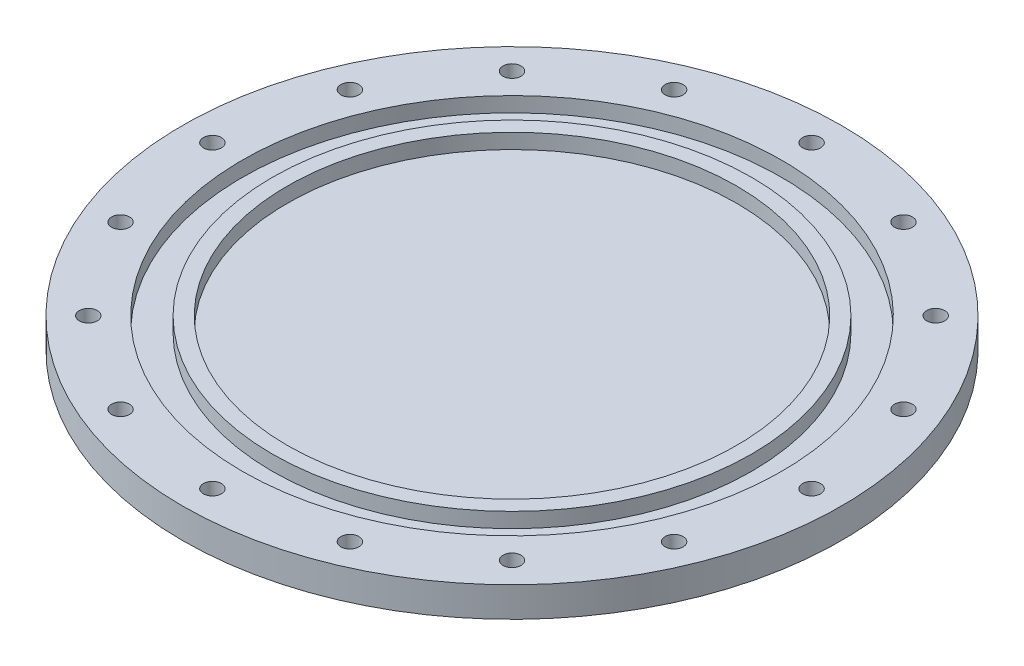
ISO-10303-21;
HEADER;
FILE_DESCRIPTION(('STEP AP214'),'2;1');
FILE_NAME('part.step','',(''),(''),'','','');
FILE_SCHEMA(('AUTOMOTIVE_DESIGN { 1 0 10303 214 1 1 1 1 }'));
ENDSEC;
DATA;
#1=APPLICATION_CONTEXT('core data for automotive mechanical design processes');
#2=APPLICATION_PROTOCOL_DEFINITION('international standard','automotive_design',2000,#1);
#3=PRODUCT_CONTEXT('',#1,'mechanical');
#4=PRODUCT('Part','Part','',(#3));
#5=PRODUCT_RELATED_PRODUCT_CATEGORY('part','',(#4));
#6=PRODUCT_DEFINITION_FORMATION('','',#4);
#7=PRODUCT_DEFINITION_CONTEXT('part definition',#1,'design');
#8=PRODUCT_DEFINITION('design','',#6,#7);
#9=PRODUCT_DEFINITION_SHAPE('','',#8);
#10=(LENGTH_UNIT() NAMED_UNIT(*) SI_UNIT(.MILLI.,.METRE.));
#11=(NAMED_UNIT(*) PLANE_ANGLE_UNIT() SI_UNIT($,.RADIAN.));
#12=(NAMED_UNIT(*) SI_UNIT($,.STERADIAN.) SOLID_ANGLE_UNIT());
#13=UNCERTAINTY_MEASURE_WITH_UNIT(LENGTH_MEASURE(1.E-05),#10,'distance_accuracy_value','');
#14=(GEOMETRIC_REPRESENTATION_CONTEXT(3) GLOBAL_UNCERTAINTY_ASSIGNED_CONTEXT((#13)) GLOBAL_UNIT_ASSIGNED_CONTEXT((#10,
#11,#12)) REPRESENTATION_CONTEXT('',''));
#15=CARTESIAN_POINT('',(0.,0.,0.));
#16=DIRECTION('',(0.,0.,1.));
#17=DIRECTION('',(1.,0.,0.));
#18=AXIS2_PLACEMENT_3D('',#15,#16,#17);
#19=CARTESIAN_POINT('',(0.,10.,0.));
#20=DIRECTION('',(0.,-1.,0.));
#21=DIRECTION('',(0.,0.,-1.));
#22=AXIS2_PLACEMENT_3D('',#19,#20,#21);
#23=CYLINDRICAL_SURFACE('',#22,90.);
#24=CARTESIAN_POINT('',(0.,5.,0.));
#25=DIRECTION('',(0.,1.,0.));
#26=DIRECTION('',(0.,0.,1.));
#27=AXIS2_PLACEMENT_3D('',#24,#25,#26);
#28=CIRCLE('',#27,90.);
#29=CARTESIAN_POINT('',(0.,5.,90.));
#30=VERTEX_POINT('',#29);
#31=EDGE_CURVE('E57',#30,#30,#28,.T.);
#32=ORIENTED_EDGE('',*,*,#31,.F.);
#33=EDGE_LOOP('',(#32));
#34=FACE_BOUND('',#33,.T.);
#35=CARTESIAN_POINT('',(0.,10.,0.));
#36=DIRECTION('',(0.,1.,0.));
#37=DIRECTION('',(0.,0.,1.));
#38=AXIS2_PLACEMENT_3D('',#35,#36,#37);
#39=CIRCLE('',#38,90.);
#40=CARTESIAN_POINT('',(0.,10.,90.));
#41=VERTEX_POINT('',#40);
#42=EDGE_CURVE('E65',#41,#41,#39,.T.);
#43=ORIENTED_EDGE('',*,*,#42,.T.);
#44=EDGE_LOOP('',(#43));
#45=FACE_BOUND('',#44,.T.);
#46=ADVANCED_FACE('F50',(#34,#45),#23,.F.);
#47=CARTESIAN_POINT('',(0.,10.,-100.));
#48=DIRECTION('',(0.,-1.,0.));
#49=DIRECTION('',(0.,0.,-1.));
#50=AXIS2_PLACEMENT_3D('',#47,#48,#49);
#51=CYLINDRICAL_SURFACE('',#50,3.);
#52=CARTESIAN_POINT('',(0.,10.,-100.));
#53=DIRECTION('',(0.,1.,0.));
#54=DIRECTION('',(0.,0.,1.));
#55=AXIS2_PLACEMENT_3D('',#52,#53,#54);
#56=CIRCLE('',#55,3.);
#57=CARTESIAN_POINT('',(0.,10.,-97.));
#58=VERTEX_POINT('',#57);
#59=EDGE_CURVE('E123',#58,#58,#56,.T.);
#60=ORIENTED_EDGE('',*,*,#59,.T.);
#61=EDGE_LOOP('',(#60));
#62=FACE_BOUND('',#61,.T.);
#63=CARTESIAN_POINT('',(0.,0.,-100.));
#64=DIRECTION('',(0.,1.,0.));
#65=DIRECTION('',(0.,0.,1.));
#66=AXIS2_PLACEMENT_3D('',#63,#64,#65);
#67=CIRCLE('',#66,3.);
#68=CARTESIAN_POINT('',(0.,0.,-97.));
#69=VERTEX_POINT('',#68);
#70=EDGE_CURVE('E72',#69,#69,#67,.T.);
#71=ORIENTED_EDGE('',*,*,#70,.F.);
#72=EDGE_LOOP('',(#71));
#73=FACE_BOUND('',#72,.T.);
#74=ADVANCED_FACE('F199',(#62,#73),#51,.F.);
#75=CARTESIAN_POINT('',(38.2683432365091,10.,-92.3879532511297));
#76=DIRECTION('',(0.,-1.,0.));
#77=DIRECTION('',(0.,0.,-1.));
#78=AXIS2_PLACEMENT_3D('',#75,#76,#77);
#79=CYLINDRICAL_SURFACE('',#78,3.);
#80=CARTESIAN_POINT('',(38.2683432365091,10.,-92.3879532511297));
#81=DIRECTION('',(0.,1.,0.));
#82=DIRECTION('',(0.,0.,1.));
#83=AXIS2_PLACEMENT_3D('',#80,#81,#82);
#84=CIRCLE('',#83,3.);
#85=CARTESIAN_POINT('',(38.2683432365091,10.,-89.3879532511297));
#86=VERTEX_POINT('',#85);
#87=EDGE_CURVE('E126',#86,#86,#84,.T.);
#88=ORIENTED_EDGE('',*,*,#87,.T.);
#89=EDGE_LOOP('',(#88));
#90=FACE_BOUND('',#89,.T.);
#91=CARTESIAN_POINT('',(38.2683432365091,0.,-92.3879532511297));
#92=DIRECTION('',(0.,1.,0.));
#93=DIRECTION('',(0.,0.,1.));
#94=AXIS2_PLACEMENT_3D('',#91,#92,#93);
#95=CIRCLE('',#94,3.);
#96=CARTESIAN_POINT('',(38.2683432365091,0.,-89.3879532511297));
#97=VERTEX_POINT('',#96);
#98=EDGE_CURVE('E75',#97,#97,#95,.T.);
#99=ORIENTED_EDGE('',*,*,#98,.F.);
#100=EDGE_LOOP('',(#99));
#101=FACE_BOUND('',#100,.T.);
#102=ADVANCED_FACE('F205',(#90,#101),#79,.F.);
#103=CARTESIAN_POINT('',(70.7106781186556,10.,-70.7106781186567));
#104=DIRECTION('',(0.,-1.,0.));
#105=DIRECTION('',(0.,0.,-1.));
#106=AXIS2_PLACEMENT_3D('',#103,#104,#105);
#107=CYLINDRICAL_SURFACE('',#106,3.00000000000001);
#108=CARTESIAN_POINT('',(70.7106781186556,10.,-70.7106781186567));
#109=DIRECTION('',(0.,1.,0.));
#110=DIRECTION('',(0.,0.,1.));
#111=AXIS2_PLACEMENT_3D('',#108,#109,#110);
#112=CIRCLE('',#111,3.00000000000001);
#113=CARTESIAN_POINT('',(70.7106781186556,10.,-67.7106781186567));
#114=VERTEX_POINT('',#113);
#115=EDGE_CURVE('E129',#114,#114,#112,.T.);
#116=ORIENTED_EDGE('',*,*,#115,.T.);
#117=EDGE_LOOP('',(#116));
#118=FACE_BOUND('',#117,.T.);
#119=CARTESIAN_POINT('',(70.7106781186556,0.,-70.7106781186567));
#120=DIRECTION('',(0.,1.,0.));
#121=DIRECTION('',(0.,0.,1.));
#122=AXIS2_PLACEMENT_3D('',#119,#120,#121);
#123=CIRCLE('',#122,3.00000000000001);
#124=CARTESIAN_POINT('',(70.7106781186556,0.,-67.7106781186567));
#125=VERTEX_POINT('',#124);
#126=EDGE_CURVE('E78',#125,#125,#123,.T.);
#127=ORIENTED_EDGE('',*,*,#126,.F.);
#128=EDGE_LOOP('',(#127));
#129=FACE_BOUND('',#128,.T.);
#130=ADVANCED_FACE('F215',(#118,#129),#107,.F.);
#131=CARTESIAN_POINT('',(92.3879532511304,10.,-38.2683432365115));
#132=DIRECTION('',(0.,-1.,0.));
#133=DIRECTION('',(0.,0.,-1.));
#134=AXIS2_PLACEMENT_3D('',#131,#132,#133);
#135=CYLINDRICAL_SURFACE('',#134,3.00000000000001);
#136=CARTESIAN_POINT('',(92.3879532511304,10.,-38.2683432365115));
#137=DIRECTION('',(0.,1.,0.));
#138=DIRECTION('',(0.,0.,1.));
#139=AXIS2_PLACEMENT_3D('',#136,#137,#138);
#140=CIRCLE('',#139,3.00000000000001);
#141=CARTESIAN_POINT('',(92.3879532511304,10.,-35.2683432365115));
#142=VERTEX_POINT('',#141);
#143=EDGE_CURVE('E132',#142,#142,#140,.T.);
#144=ORIENTED_EDGE('',*,*,#143,.T.);
#145=EDGE_LOOP('',(#144));
#146=FACE_BOUND('',#145,.T.);
#147=CARTESIAN_POINT('',(92.3879532511304,0.,-38.2683432365115));
#148=DIRECTION('',(0.,1.,0.));
#149=DIRECTION('',(0.,0.,1.));
#150=AXIS2_PLACEMENT_3D('',#147,#148,#149);
#151=CIRCLE('',#150,3.00000000000001);
#152=CARTESIAN_POINT('',(92.3879532511304,0.,-35.2683432365115));
#153=VERTEX_POINT('',#152);
#154=EDGE_CURVE('E81',#153,#153,#151,.T.);
#155=ORIENTED_EDGE('',*,*,#154,.F.);
#156=EDGE_LOOP('',(#155));
#157=FACE_BOUND('',#156,.T.);
#158=ADVANCED_FACE('F219',(#146,#157),#135,.F.);
#159=CARTESIAN_POINT('',(100.000000000003,10.,-2.76131949507121E-12));
#160=DIRECTION('',(0.,-1.,0.));
#161=DIRECTION('',(0.,0.,-1.));
#162=AXIS2_PLACEMENT_3D('',#159,#160,#161);
#163=CYLINDRICAL_SURFACE('',#162,3.00000000000001);
#164=CARTESIAN_POINT('',(100.000000000003,10.,-2.76131949507121E-12));
#165=DIRECTION('',(0.,1.,0.));
#166=DIRECTION('',(0.,0.,1.));
#167=AXIS2_PLACEMENT_3D('',#164,#165,#166);
#168=CIRCLE('',#167,3.00000000000001);
#169=CARTESIAN_POINT('',(100.000000000003,10.,2.99999999999725));
#170=VERTEX_POINT('',#169);
#171=EDGE_CURVE('E135',#170,#170,#168,.T.);
#172=ORIENTED_EDGE('',*,*,#171,.T.);
#173=EDGE_LOOP('',(#172));
#174=FACE_BOUND('',#173,.T.);
#175=CARTESIAN_POINT('',(100.000000000003,0.,-2.76131949507121E-12));
#176=DIRECTION('',(0.,1.,0.));
#177=DIRECTION('',(0.,0.,1.));
#178=AXIS2_PLACEMENT_3D('',#175,#176,#177);
#179=CIRCLE('',#178,3.00000000000001);
#180=CARTESIAN_POINT('',(100.000000000003,0.,2.99999999999725));
#181=VERTEX_POINT('',#180);
#182=EDGE_CURVE('E84',#181,#181,#179,.T.);
#183=ORIENTED_EDGE('',*,*,#182,.F.);
#184=EDGE_LOOP('',(#183));
#185=FACE_BOUND('',#184,.T.);
#186=ADVANCED_FACE('F223',(#174,#185),#163,.F.);
#187=CARTESIAN_POINT('',(92.3879532511325,10.,38.2683432365064));
#188=DIRECTION('',(0.,-1.,0.));
#189=DIRECTION('',(0.,0.,-1.));
#190=AXIS2_PLACEMENT_3D('',#187,#188,#189);
#191=CYLINDRICAL_SURFACE('',#190,3.00000000000001);
#192=CARTESIAN_POINT('',(92.3879532511325,10.,38.2683432365064));
#193=DIRECTION('',(0.,1.,0.));
#194=DIRECTION('',(0.,0.,1.));
#195=AXIS2_PLACEMENT_3D('',#192,#193,#194);
#196=CIRCLE('',#195,3.00000000000001);
#197=CARTESIAN_POINT('',(92.3879532511325,10.,41.2683432365064));
#198=VERTEX_POINT('',#197);
#199=EDGE_CURVE('E138',#198,#198,#196,.T.);
#200=ORIENTED_EDGE('',*,*,#199,.T.);
#201=EDGE_LOOP('',(#200));
#202=FACE_BOUND('',#201,.T.);
#203=CARTESIAN_POINT('',(92.3879532511325,0.,38.2683432365064));
#204=DIRECTION('',(0.,1.,0.));
#205=DIRECTION('',(0.,0.,1.));
#206=AXIS2_PLACEMENT_3D('',#203,#204,#205);
#207=CIRCLE('',#206,3.00000000000001);
#208=CARTESIAN_POINT('',(92.3879532511325,0.,41.2683432365064));
#209=VERTEX_POINT('',#208);
#210=EDGE_CURVE('E87',#209,#209,#207,.T.);
#211=ORIENTED_EDGE('',*,*,#210,.F.);
#212=EDGE_LOOP('',(#211));
#213=FACE_BOUND('',#212,.T.);
#214=ADVANCED_FACE('F227',(#202,#213),#191,.F.);
#215=CARTESIAN_POINT('',(70.7106781186595,10.,70.7106781186528));
#216=DIRECTION('',(0.,-1.,0.));
#217=DIRECTION('',(0.,0.,-1.));
#218=AXIS2_PLACEMENT_3D('',#215,#216,#217);
#219=CYLINDRICAL_SURFACE('',#218,3.00000000000001);
#220=CARTESIAN_POINT('',(70.7106781186595,10.,70.7106781186528));
#221=DIRECTION('',(0.,1.,0.));
#222=DIRECTION('',(0.,0.,1.));
#223=AXIS2_PLACEMENT_3D('',#220,#221,#222);
#224=CIRCLE('',#223,3.00000000000001);
#225=CARTESIAN_POINT('',(70.7106781186595,10.,73.7106781186528));
#226=VERTEX_POINT('',#225);
#227=EDGE_CURVE('E141',#226,#226,#224,.T.);
#228=ORIENTED_EDGE('',*,*,#227,.T.);
#229=EDGE_LOOP('',(#228));
#230=FACE_BOUND('',#229,.T.);
#231=CARTESIAN_POINT('',(70.7106781186595,0.,70.7106781186528));
#232=DIRECTION('',(0.,1.,0.));
#233=DIRECTION('',(0.,0.,1.));
#234=AXIS2_PLACEMENT_3D('',#231,#232,#233);
#235=CIRCLE('',#234,3.00000000000001);
#236=CARTESIAN_POINT('',(70.7106781186595,0.,73.7106781186528));
#237=VERTEX_POINT('',#236);
#238=EDGE_CURVE('E90',#237,#237,#235,.T.);
#239=ORIENTED_EDGE('',*,*,#238,.F.);
#240=EDGE_LOOP('',(#239));
#241=FACE_BOUND('',#240,.T.);
#242=ADVANCED_FACE('F231',(#230,#241),#219,.F.);
#243=CARTESIAN_POINT('',(38.2683432365143,10.,92.3879532511276));
#244=DIRECTION('',(0.,-1.,0.));
#245=DIRECTION('',(0.,0.,-1.));
#246=AXIS2_PLACEMENT_3D('',#243,#244,#245);
#247=CYLINDRICAL_SURFACE('',#246,3.);
#248=CARTESIAN_POINT('',(38.2683432365143,10.,92.3879532511276));
#249=DIRECTION('',(0.,1.,0.));
#250=DIRECTION('',(0.,0.,1.));
#251=AXIS2_PLACEMENT_3D('',#248,#249,#250);
#252=CIRCLE('',#251,3.);
#253=CARTESIAN_POINT('',(38.2683432365143,10.,95.3879532511276));
#254=VERTEX_POINT('',#253);
#255=EDGE_CURVE('E144',#254,#254,#252,.T.);
#256=ORIENTED_EDGE('',*,*,#255,.T.);
#257=EDGE_LOOP('',(#256));
#258=FACE_BOUND('',#257,.T.);
#259=CARTESIAN_POINT('',(38.2683432365143,0.,92.3879532511276));
#260=DIRECTION('',(0.,1.,0.));
#261=DIRECTION('',(0.,0.,1.));
#262=AXIS2_PLACEMENT_3D('',#259,#260,#261);
#263=CIRCLE('',#262,3.);
#264=CARTESIAN_POINT('',(38.2683432365143,0.,95.3879532511276));
#265=VERTEX_POINT('',#264);
#266=EDGE_CURVE('E93',#265,#265,#263,.T.);
#267=ORIENTED_EDGE('',*,*,#266,.F.);
#268=EDGE_LOOP('',(#267));
#269=FACE_BOUND('',#268,.T.);
#270=ADVANCED_FACE('F235',(#258,#269),#247,.F.);
#271=CARTESIAN_POINT('',(5.52263899014242E-12,10.,100.));
#272=DIRECTION('',(0.,-1.,0.));
#273=DIRECTION('',(0.,0.,-1.));
#274=AXIS2_PLACEMENT_3D('',#271,#272,#273);
#275=CYLINDRICAL_SURFACE('',#274,3.);
#276=CARTESIAN_POINT('',(5.52263899014242E-12,10.,100.));
#277=DIRECTION('',(0.,1.,0.));
#278=DIRECTION('',(0.,0.,1.));
#279=AXIS2_PLACEMENT_3D('',#276,#277,#278);
#280=CIRCLE('',#279,3.);
#281=CARTESIAN_POINT('',(5.52263899014242E-12,10.,103.));
#282=VERTEX_POINT('',#281);
#283=EDGE_CURVE('E147',#282,#282,#280,.T.);
#284=ORIENTED_EDGE('',*,*,#283,.T.);
#285=EDGE_LOOP('',(#284));
#286=FACE_BOUND('',#285,.T.);
#287=CARTESIAN_POINT('',(5.52263899014242E-12,0.,100.));
#288=DIRECTION('',(0.,1.,0.));
#289=DIRECTION('',(0.,0.,1.));
#290=AXIS2_PLACEMENT_3D('',#287,#288,#289);
#291=CIRCLE('',#290,3.);
#292=CARTESIAN_POINT('',(5.52263899014242E-12,0.,103.));
#293=VERTEX_POINT('',#292);
#294=EDGE_CURVE('E96',#293,#293,#291,.T.);
#295=ORIENTED_EDGE('',*,*,#294,.F.);
#296=EDGE_LOOP('',(#295));
#297=FACE_BOUND('',#296,.T.);
#298=ADVANCED_FACE('F239',(#286,#297),#275,.F.);
#299=CARTESIAN_POINT('',(-38.2683432365037,10.,92.3879532511297));
#300=DIRECTION('',(0.,-1.,0.));
#301=DIRECTION('',(0.,0.,-1.));
#302=AXIS2_PLACEMENT_3D('',#299,#300,#301);
#303=CYLINDRICAL_SURFACE('',#302,3.);
#304=CARTESIAN_POINT('',(-38.2683432365037,10.,92.3879532511297));
#305=DIRECTION('',(0.,1.,0.));
#306=DIRECTION('',(0.,0.,1.));
#307=AXIS2_PLACEMENT_3D('',#304,#305,#306);
#308=CIRCLE('',#307,3.);
#309=CARTESIAN_POINT('',(-38.2683432365037,10.,95.3879532511298));
#310=VERTEX_POINT('',#309);
#311=EDGE_CURVE('E150',#310,#310,#308,.T.);
#312=ORIENTED_EDGE('',*,*,#311,.T.);
#313=EDGE_LOOP('',(#312));
#314=FACE_BOUND('',#313,.T.);
#315=CARTESIAN_POINT('',(-38.2683432365037,0.,92.3879532511297));
#316=DIRECTION('',(0.,1.,0.));
#317=DIRECTION('',(0.,0.,1.));
#318=AXIS2_PLACEMENT_3D('',#315,#316,#317);
#319=CIRCLE('',#318,3.);
#320=CARTESIAN_POINT('',(-38.2683432365037,0.,95.3879532511298));
#321=VERTEX_POINT('',#320);
#322=EDGE_CURVE('E99',#321,#321,#319,.T.);
#323=ORIENTED_EDGE('',*,*,#322,.F.);
#324=EDGE_LOOP('',(#323));
#325=FACE_BOUND('',#324,.T.);
#326=ADVANCED_FACE('F243',(#314,#325),#303,.F.);
#327=CARTESIAN_POINT('',(-70.7106781186501,10.,70.7106781186567));
#328=DIRECTION('',(0.,-1.,0.));
#329=DIRECTION('',(0.,0.,-1.));
#330=AXIS2_PLACEMENT_3D('',#327,#328,#329);
#331=CYLINDRICAL_SURFACE('',#330,3.00000000000001);
#332=CARTESIAN_POINT('',(-70.7106781186501,10.,70.7106781186567));
#333=DIRECTION('',(0.,1.,0.));
#334=DIRECTION('',(0.,0.,1.));
#335=AXIS2_PLACEMENT_3D('',#332,#333,#334);
#336=CIRCLE('',#335,3.00000000000001);
#337=CARTESIAN_POINT('',(-70.7106781186501,10.,73.7106781186567));
#338=VERTEX_POINT('',#337);
#339=EDGE_CURVE('E153',#338,#338,#336,.T.);
#340=ORIENTED_EDGE('',*,*,#339,.T.);
#341=EDGE_LOOP('',(#340));
#342=FACE_BOUND('',#341,.T.);
#343=CARTESIAN_POINT('',(-70.7106781186501,0.,70.7106781186567));
#344=DIRECTION('',(0.,1.,0.));
#345=DIRECTION('',(0.,0.,1.));
#346=AXIS2_PLACEMENT_3D('',#343,#344,#345);
#347=CIRCLE('',#346,3.00000000000001);
#348=CARTESIAN_POINT('',(-70.7106781186501,0.,73.7106781186567));
#349=VERTEX_POINT('',#348);
#350=EDGE_CURVE('E102',#349,#349,#347,.T.);
#351=ORIENTED_EDGE('',*,*,#350,.F.);
#352=EDGE_LOOP('',(#351));
#353=FACE_BOUND('',#352,.T.);
#354=ADVANCED_FACE('F247',(#342,#353),#331,.F.);
#355=CARTESIAN_POINT('',(-92.3879532511248,10.,38.2683432365116));
#356=DIRECTION('',(0.,-1.,0.));
#357=DIRECTION('',(0.,0.,-1.));
#358=AXIS2_PLACEMENT_3D('',#355,#356,#357);
#359=CYLINDRICAL_SURFACE('',#358,3.00000000000001);
#360=CARTESIAN_POINT('',(-92.3879532511248,10.,38.2683432365116));
#361=DIRECTION('',(0.,1.,0.));
#362=DIRECTION('',(0.,0.,1.));
#363=AXIS2_PLACEMENT_3D('',#360,#361,#362);
#364=CIRCLE('',#363,3.00000000000001);
#365=CARTESIAN_POINT('',(-92.3879532511248,10.,41.2683432365116));
#366=VERTEX_POINT('',#365);
#367=EDGE_CURVE('E156',#366,#366,#364,.T.);
#368=ORIENTED_EDGE('',*,*,#367,.T.);
#369=EDGE_LOOP('',(#368));
#370=FACE_BOUND('',#369,.T.);
#371=CARTESIAN_POINT('',(-92.3879532511248,0.,38.2683432365116));
#372=DIRECTION('',(0.,1.,0.));
#373=DIRECTION('',(0.,0.,1.));
#374=AXIS2_PLACEMENT_3D('',#371,#372,#373);
#375=CIRCLE('',#374,3.00000000000001);
#376=CARTESIAN_POINT('',(-92.3879532511248,0.,41.2683432365116));
#377=VERTEX_POINT('',#376);
#378=EDGE_CURVE('E105',#377,#377,#375,.T.);
#379=ORIENTED_EDGE('',*,*,#378,.F.);
#380=EDGE_LOOP('',(#379));
#381=FACE_BOUND('',#380,.T.);
#382=ADVANCED_FACE('F251',(#370,#381),#359,.F.);
#383=CARTESIAN_POINT('',(-99.9999999999973,10.,2.77356596306269E-12));
#384=DIRECTION('',(0.,-1.,0.));
#385=DIRECTION('',(0.,0.,-1.));
#386=AXIS2_PLACEMENT_3D('',#383,#384,#385);
#387=CYLINDRICAL_SURFACE('',#386,3.00000000000001);
#388=CARTESIAN_POINT('',(-99.9999999999973,10.,2.77356596306269E-12));
#389=DIRECTION('',(0.,1.,0.));
#390=DIRECTION('',(0.,0.,1.));
#391=AXIS2_PLACEMENT_3D('',#388,#389,#390);
#392=CIRCLE('',#391,3.00000000000001);
#393=CARTESIAN_POINT('',(-99.9999999999973,10.,3.00000000000278));
#394=VERTEX_POINT('',#393);
#395=EDGE_CURVE('E159',#394,#394,#392,.T.);
#396=ORIENTED_EDGE('',*,*,#395,.T.);
#397=EDGE_LOOP('',(#396));
#398=FACE_BOUND('',#397,.T.);
#399=CARTESIAN_POINT('',(-99.9999999999973,0.,2.77356596306269E-12));
#400=DIRECTION('',(0.,1.,0.));
#401=DIRECTION('',(0.,0.,1.));
#402=AXIS2_PLACEMENT_3D('',#399,#400,#401);
#403=CIRCLE('',#402,3.00000000000001);
#404=CARTESIAN_POINT('',(-99.9999999999973,0.,3.00000000000278));
#405=VERTEX_POINT('',#404);
#406=EDGE_CURVE('E108',#405,#405,#403,.T.);
#407=ORIENTED_EDGE('',*,*,#406,.F.);
#408=EDGE_LOOP('',(#407));
#409=FACE_BOUND('',#408,.T.);
#410=ADVANCED_FACE('F255',(#398,#409),#387,.F.);
#411=CARTESIAN_POINT('',(-92.387953251127,10.,-38.2683432365065));
#412=DIRECTION('',(0.,-1.,0.));
#413=DIRECTION('',(0.,0.,-1.));
#414=AXIS2_PLACEMENT_3D('',#411,#412,#413);
#415=CYLINDRICAL_SURFACE('',#414,3.00000000000001);
#416=CARTESIAN_POINT('',(-92.387953251127,10.,-38.2683432365065));
#417=DIRECTION('',(0.,1.,0.));
#418=DIRECTION('',(0.,0.,1.));
#419=AXIS2_PLACEMENT_3D('',#416,#417,#418);
#420=CIRCLE('',#419,3.00000000000001);
#421=CARTESIAN_POINT('',(-92.387953251127,10.,-35.2683432365065));
#422=VERTEX_POINT('',#421);
#423=EDGE_CURVE('E162',#422,#422,#420,.T.);
#424=ORIENTED_EDGE('',*,*,#423,.T.);
#425=EDGE_LOOP('',(#424));
#426=FACE_BOUND('',#425,.T.);
#427=CARTESIAN_POINT('',(-92.387953251127,0.,-38.2683432365065));
#428=DIRECTION('',(0.,1.,0.));
#429=DIRECTION('',(0.,0.,1.));
#430=AXIS2_PLACEMENT_3D('',#427,#428,#429);
#431=CIRCLE('',#430,3.00000000000001);
#432=CARTESIAN_POINT('',(-92.387953251127,0.,-35.2683432365065));
#433=VERTEX_POINT('',#432);
#434=EDGE_CURVE('E111',#433,#433,#431,.T.);
#435=ORIENTED_EDGE('',*,*,#434,.F.);
#436=EDGE_LOOP('',(#435));
#437=FACE_BOUND('',#436,.T.);
#438=ADVANCED_FACE('F259',(#426,#437),#415,.F.);
#439=CARTESIAN_POINT('',(-70.710678118654,10.,-70.7106781186528));
#440=DIRECTION('',(0.,-1.,0.));
#441=DIRECTION('',(0.,0.,-1.));
#442=AXIS2_PLACEMENT_3D('',#439,#440,#441);
#443=CYLINDRICAL_SURFACE('',#442,3.00000000000001);
#444=CARTESIAN_POINT('',(-70.710678118654,10.,-70.7106781186528));
#445=DIRECTION('',(0.,1.,0.));
#446=DIRECTION('',(0.,0.,1.));
#447=AXIS2_PLACEMENT_3D('',#444,#445,#446);
#448=CIRCLE('',#447,3.00000000000001);
#449=CARTESIAN_POINT('',(-70.710678118654,10.,-67.7106781186528));
#450=VERTEX_POINT('',#449);
#451=EDGE_CURVE('E165',#450,#450,#448,.T.);
#452=ORIENTED_EDGE('',*,*,#451,.T.);
#453=EDGE_LOOP('',(#452));
#454=FACE_BOUND('',#453,.T.);
#455=CARTESIAN_POINT('',(-70.710678118654,0.,-70.7106781186528));
#456=DIRECTION('',(0.,1.,0.));
#457=DIRECTION('',(0.,0.,1.));
#458=AXIS2_PLACEMENT_3D('',#455,#456,#457);
#459=CIRCLE('',#458,3.00000000000001);
#460=CARTESIAN_POINT('',(-70.710678118654,0.,-67.7106781186528));
#461=VERTEX_POINT('',#460);
#462=EDGE_CURVE('E114',#461,#461,#459,.T.);
#463=ORIENTED_EDGE('',*,*,#462,.F.);
#464=EDGE_LOOP('',(#463));
#465=FACE_BOUND('',#464,.T.);
#466=ADVANCED_FACE('F262',(#454,#465),#443,.F.);
#467=CARTESIAN_POINT('',(-38.2683432365088,10.,-92.3879532511276));
#468=DIRECTION('',(0.,-1.,0.));
#469=DIRECTION('',(0.,0.,-1.));
#470=AXIS2_PLACEMENT_3D('',#467,#468,#469);
#471=CYLINDRICAL_SURFACE('',#470,3.);
#472=CARTESIAN_POINT('',(-38.2683432365088,10.,-92.3879532511276));
#473=DIRECTION('',(0.,1.,0.));
#474=DIRECTION('',(0.,0.,1.));
#475=AXIS2_PLACEMENT_3D('',#472,#473,#474);
#476=CIRCLE('',#475,3.);
#477=CARTESIAN_POINT('',(-38.2683432365088,10.,-89.3879532511276));
#478=VERTEX_POINT('',#477);
#479=EDGE_CURVE('E71',#478,#478,#476,.T.);
#480=ORIENTED_EDGE('',*,*,#479,.T.);
#481=EDGE_LOOP('',(#480));
#482=FACE_BOUND('',#481,.T.);
#483=CARTESIAN_POINT('',(-38.2683432365088,0.,-92.3879532511276));
#484=DIRECTION('',(0.,1.,0.));
#485=DIRECTION('',(0.,0.,1.));
#486=AXIS2_PLACEMENT_3D('',#483,#484,#485);
#487=CIRCLE('',#486,3.);
#488=CARTESIAN_POINT('',(-38.2683432365088,0.,-89.3879532511276));
#489=VERTEX_POINT('',#488);
#490=EDGE_CURVE('E117',#489,#489,#487,.T.);
#491=ORIENTED_EDGE('',*,*,#490,.F.);
#492=EDGE_LOOP('',(#491));
#493=FACE_BOUND('',#492,.T.);
#494=ADVANCED_FACE('F52',(#482,#493),#471,.F.);
#495=CARTESIAN_POINT('',(0.,10.,0.));
#496=DIRECTION('',(0.,-1.,0.));
#497=DIRECTION('',(0.,0.,-1.));
#498=AXIS2_PLACEMENT_3D('',#495,#496,#497);
#499=CYLINDRICAL_SURFACE('',#498,110.);
#500=CARTESIAN_POINT('',(0.,10.,0.));
#501=DIRECTION('',(0.,1.,0.));
#502=DIRECTION('',(0.,0.,1.));
#503=AXIS2_PLACEMENT_3D('',#500,#501,#502);
#504=CIRCLE('',#503,110.);
#505=CARTESIAN_POINT('',(0.,10.,110.));
#506=VERTEX_POINT('',#505);
#507=EDGE_CURVE('E61',#506,#506,#504,.T.);
#508=ORIENTED_EDGE('',*,*,#507,.F.);
#509=EDGE_LOOP('',(#508));
#510=FACE_BOUND('',#509,.T.);
#511=CARTESIAN_POINT('',(0.,0.,0.));
#512=DIRECTION('',(0.,1.,0.));
#513=DIRECTION('',(0.,0.,1.));
#514=AXIS2_PLACEMENT_3D('',#511,#512,#513);
#515=CIRCLE('',#514,110.);
#516=CARTESIAN_POINT('',(0.,0.,110.));
#517=VERTEX_POINT('',#516);
#518=EDGE_CURVE('E68',#517,#517,#515,.T.);
#519=ORIENTED_EDGE('',*,*,#518,.T.);
#520=EDGE_LOOP('',(#519));
#521=FACE_BOUND('',#520,.T.);
#522=ADVANCED_FACE('F210',(#510,#521),#499,.T.);
#523=CARTESIAN_POINT('',(0.,10.,0.));
#524=DIRECTION('',(0.,1.,0.));
#525=DIRECTION('',(0.,0.,1.));
#526=AXIS2_PLACEMENT_3D('',#523,#524,#525);
#527=PLANE('',#526);
#528=ORIENTED_EDGE('',*,*,#479,.F.);
#529=EDGE_LOOP('',(#528));
#530=FACE_BOUND('',#529,.T.);
#531=ORIENTED_EDGE('',*,*,#451,.F.);
#532=EDGE_LOOP('',(#531));
#533=FACE_BOUND('',#532,.T.);
#534=ORIENTED_EDGE('',*,*,#423,.F.);
#535=EDGE_LOOP('',(#534));
#536=FACE_BOUND('',#535,.T.);
#537=ORIENTED_EDGE('',*,*,#395,.F.);
#538=EDGE_LOOP('',(#537));
#539=FACE_BOUND('',#538,.T.);
#540=ORIENTED_EDGE('',*,*,#367,.F.);
#541=EDGE_LOOP('',(#540));
#542=FACE_BOUND('',#541,.T.);
#543=ORIENTED_EDGE('',*,*,#339,.F.);
#544=EDGE_LOOP('',(#543));
#545=FACE_BOUND('',#544,.T.);
#546=ORIENTED_EDGE('',*,*,#311,.F.);
#547=EDGE_LOOP('',(#546));
#548=FACE_BOUND('',#547,.T.);
#549=ORIENTED_EDGE('',*,*,#283,.F.);
#550=EDGE_LOOP('',(#549));
#551=FACE_BOUND('',#550,.T.);
#552=ORIENTED_EDGE('',*,*,#255,.F.);
#553=EDGE_LOOP('',(#552));
#554=FACE_BOUND('',#553,.T.);
#555=ORIENTED_EDGE('',*,*,#227,.F.);
#556=EDGE_LOOP('',(#555));
#557=FACE_BOUND('',#556,.T.);
#558=ORIENTED_EDGE('',*,*,#199,.F.);
#559=EDGE_LOOP('',(#558));
#560=FACE_BOUND('',#559,.T.);
#561=ORIENTED_EDGE('',*,*,#171,.F.);
#562=EDGE_LOOP('',(#561));
#563=FACE_BOUND('',#562,.T.);
#564=ORIENTED_EDGE('',*,*,#143,.F.);
#565=EDGE_LOOP('',(#564));
#566=FACE_BOUND('',#565,.T.);
#567=ORIENTED_EDGE('',*,*,#115,.F.);
#568=EDGE_LOOP('',(#567));
#569=FACE_BOUND('',#568,.T.);
#570=ORIENTED_EDGE('',*,*,#87,.F.);
#571=EDGE_LOOP('',(#570));
#572=FACE_BOUND('',#571,.T.);
#573=ORIENTED_EDGE('',*,*,#59,.F.);
#574=EDGE_LOOP('',(#573));
#575=FACE_BOUND('',#574,.T.);
#576=ORIENTED_EDGE('',*,*,#42,.F.);
#577=EDGE_LOOP('',(#576));
#578=FACE_BOUND('',#577,.T.);
#579=ORIENTED_EDGE('',*,*,#507,.T.);
#580=EDGE_LOOP('',(#579));
#581=FACE_BOUND('',#580,.T.);
#582=ADVANCED_FACE('F277',(#530,#533,#536,#539,#542,#545,#548,#551,#554,#557,#560,#563,#566,
#569,#572,#575,#578,#581),#527,.T.);
#583=CARTESIAN_POINT('',(0.,0.,0.));
#584=DIRECTION('',(0.,1.,0.));
#585=DIRECTION('',(0.,0.,1.));
#586=AXIS2_PLACEMENT_3D('',#583,#584,#585);
#587=PLANE('',#586);
#588=ORIENTED_EDGE('',*,*,#490,.T.);
#589=EDGE_LOOP('',(#588));
#590=FACE_BOUND('',#589,.T.);
#591=ORIENTED_EDGE('',*,*,#462,.T.);
#592=EDGE_LOOP('',(#591));
#593=FACE_BOUND('',#592,.T.);
#594=ORIENTED_EDGE('',*,*,#434,.T.);
#595=EDGE_LOOP('',(#594));
#596=FACE_BOUND('',#595,.T.);
#597=ORIENTED_EDGE('',*,*,#406,.T.);
#598=EDGE_LOOP('',(#597));
#599=FACE_BOUND('',#598,.T.);
#600=ORIENTED_EDGE('',*,*,#378,.T.);
#601=EDGE_LOOP('',(#600));
#602=FACE_BOUND('',#601,.T.);
#603=ORIENTED_EDGE('',*,*,#350,.T.);
#604=EDGE_LOOP('',(#603));
#605=FACE_BOUND('',#604,.T.);
#606=ORIENTED_EDGE('',*,*,#322,.T.);
#607=EDGE_LOOP('',(#606));
#608=FACE_BOUND('',#607,.T.);
#609=ORIENTED_EDGE('',*,*,#294,.T.);
#610=EDGE_LOOP('',(#609));
#611=FACE_BOUND('',#610,.T.);
#612=ORIENTED_EDGE('',*,*,#266,.T.);
#613=EDGE_LOOP('',(#612));
#614=FACE_BOUND('',#613,.T.);
#615=ORIENTED_EDGE('',*,*,#238,.T.);
#616=EDGE_LOOP('',(#615));
#617=FACE_BOUND('',#616,.T.);
#618=ORIENTED_EDGE('',*,*,#210,.T.);
#619=EDGE_LOOP('',(#618));
#620=FACE_BOUND('',#619,.T.);
#621=ORIENTED_EDGE('',*,*,#182,.T.);
#622=EDGE_LOOP('',(#621));
#623=FACE_BOUND('',#622,.T.);
#624=ORIENTED_EDGE('',*,*,#154,.T.);
#625=EDGE_LOOP('',(#624));
#626=FACE_BOUND('',#625,.T.);
#627=ORIENTED_EDGE('',*,*,#126,.T.);
#628=EDGE_LOOP('',(#627));
#629=FACE_BOUND('',#628,.T.);
#630=ORIENTED_EDGE('',*,*,#98,.T.);
#631=EDGE_LOOP('',(#630));
#632=FACE_BOUND('',#631,.T.);
#633=ORIENTED_EDGE('',*,*,#70,.T.);
#634=EDGE_LOOP('',(#633));
#635=FACE_BOUND('',#634,.T.);
#636=ORIENTED_EDGE('',*,*,#518,.F.);
#637=EDGE_LOOP('',(#636));
#638=FACE_BOUND('',#637,.T.);
#639=ADVANCED_FACE('F274',(#590,#593,#596,#599,#602,#605,#608,#611,#614,#617,#620,#623,#626,
#629,#632,#635,#638),#587,.F.);
#640=CARTESIAN_POINT('',(0.,5.,0.));
#641=DIRECTION('',(0.,1.,0.));
#642=DIRECTION('',(0.,0.,1.));
#643=AXIS2_PLACEMENT_3D('',#640,#641,#642);
#644=PLANE('',#643);
#645=CARTESIAN_POINT('',(0.,5.,0.));
#646=DIRECTION('',(0.,1.,0.));
#647=DIRECTION('',(0.,0.,1.));
#648=AXIS2_PLACEMENT_3D('',#645,#646,#647);
#649=CIRCLE('',#648,80.);
#650=CARTESIAN_POINT('',(0.,5.,80.));
#651=VERTEX_POINT('',#650);
#652=EDGE_CURVE('E119',#651,#651,#649,.T.);
#653=ORIENTED_EDGE('',*,*,#652,.F.);
#654=EDGE_LOOP('',(#653));
#655=FACE_BOUND('',#654,.T.);
#656=ORIENTED_EDGE('',*,*,#31,.T.);
#657=EDGE_LOOP('',(#656));
#658=FACE_BOUND('',#657,.T.);
#659=ADVANCED_FACE('F195',(#655,#658),#644,.T.);
#660=CARTESIAN_POINT('',(0.,10.,0.));
#661=DIRECTION('',(0.,-1.,0.));
#662=DIRECTION('',(0.,0.,-1.));
#663=AXIS2_PLACEMENT_3D('',#660,#661,#662);
#664=CYLINDRICAL_SURFACE('',#663,75.);
#665=CARTESIAN_POINT('',(0.,5.,0.));
#666=DIRECTION('',(0.,1.,0.));
#667=DIRECTION('',(0.,0.,1.));
#668=AXIS2_PLACEMENT_3D('',#665,#666,#667);
#669=CIRCLE('',#668,75.);
#670=CARTESIAN_POINT('',(0.,5.,75.));
#671=VERTEX_POINT('',#670);
#672=EDGE_CURVE('E11',#671,#671,#669,.T.);
#673=ORIENTED_EDGE('',*,*,#672,.F.);
#674=EDGE_LOOP('',(#673));
#675=FACE_BOUND('',#674,.T.);
#676=CARTESIAN_POINT('',(0.,10.,0.));
#677=DIRECTION('',(0.,1.,0.));
#678=DIRECTION('',(0.,0.,1.));
#679=AXIS2_PLACEMENT_3D('',#676,#677,#678);
#680=CIRCLE('',#679,75.);
#681=CARTESIAN_POINT('',(0.,10.,75.));
#682=VERTEX_POINT('',#681);
#683=EDGE_CURVE('E175',#682,#682,#680,.T.);
#684=ORIENTED_EDGE('',*,*,#683,.T.);
#685=EDGE_LOOP('',(#684));
#686=FACE_BOUND('',#685,.T.);
#687=ADVANCED_FACE('F179',(#675,#686),#664,.F.);
#688=CARTESIAN_POINT('',(0.,10.,0.));
#689=DIRECTION('',(0.,-1.,0.));
#690=DIRECTION('',(0.,0.,-1.));
#691=AXIS2_PLACEMENT_3D('',#688,#689,#690);
#692=CYLINDRICAL_SURFACE('',#691,80.);
#693=ORIENTED_EDGE('',*,*,#652,.T.);
#694=EDGE_LOOP('',(#693));
#695=FACE_BOUND('',#694,.T.);
#696=CARTESIAN_POINT('',(0.,10.,0.));
#697=DIRECTION('',(0.,1.,0.));
#698=DIRECTION('',(0.,0.,1.));
#699=AXIS2_PLACEMENT_3D('',#696,#697,#698);
#700=CIRCLE('',#699,80.);
#701=CARTESIAN_POINT('',(0.,10.,80.));
#702=VERTEX_POINT('',#701);
#703=EDGE_CURVE('E172',#702,#702,#700,.T.);
#704=ORIENTED_EDGE('',*,*,#703,.F.);
#705=EDGE_LOOP('',(#704));
#706=FACE_BOUND('',#705,.T.);
#707=ADVANCED_FACE('F185',(#695,#706),#692,.T.);
#708=CARTESIAN_POINT('',(0.,10.,0.));
#709=DIRECTION('',(0.,1.,0.));
#710=DIRECTION('',(0.,0.,1.));
#711=AXIS2_PLACEMENT_3D('',#708,#709,#710);
#712=PLANE('',#711);
#713=ORIENTED_EDGE('',*,*,#683,.F.);
#714=EDGE_LOOP('',(#713));
#715=FACE_BOUND('',#714,.T.);
#716=ORIENTED_EDGE('',*,*,#703,.T.);
#717=EDGE_LOOP('',(#716));
#718=FACE_BOUND('',#717,.T.);
#719=ADVANCED_FACE('F181',(#715,#718),#712,.T.);
#720=CARTESIAN_POINT('',(0.,5.,0.));
#721=DIRECTION('',(0.,1.,0.));
#722=DIRECTION('',(0.,0.,1.));
#723=AXIS2_PLACEMENT_3D('',#720,#721,#722);
#724=PLANE('',#723);
#725=ORIENTED_EDGE('',*,*,#672,.T.);
#726=EDGE_LOOP('',(#725));
#727=FACE_BOUND('',#726,.T.);
#728=ADVANCED_FACE('F184',(#727),#724,.T.);
#729=CLOSED_SHELL('',(#46,#74,#102,#130,#158,#186,#214,#242,#270,#298,#326,#354,#382,#410,#438,
#466,#494,#522,#582,#639,#659,#687,#707,#719,#728));
#730=MANIFOLD_SOLID_BREP('B2',#729);
#731=ADVANCED_BREP_SHAPE_REPRESENTATION('',(#18,#730),#14);
#732=SHAPE_DEFINITION_REPRESENTATION(#9,#731);
ENDSEC;
END-ISO-10303-21;
